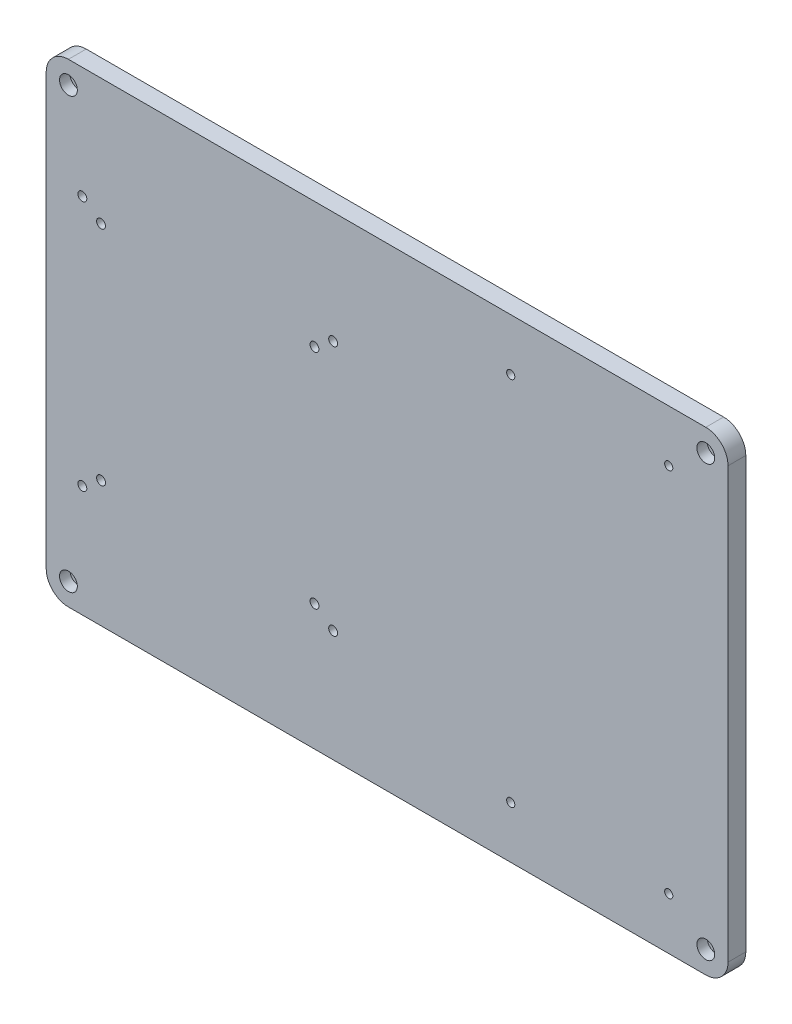
ISO-10303-21;
HEADER;
FILE_DESCRIPTION(('STEP AP214'),'2;1');
FILE_NAME('part.step','',(''),(''),'','','');
FILE_SCHEMA(('AUTOMOTIVE_DESIGN { 1 0 10303 214 1 1 1 1 }'));
ENDSEC;
DATA;
#1=APPLICATION_CONTEXT('core data for automotive mechanical design processes');
#2=APPLICATION_PROTOCOL_DEFINITION('international standard','automotive_design',2000,#1);
#3=PRODUCT_CONTEXT('',#1,'mechanical');
#4=PRODUCT('Part','Part','',(#3));
#5=PRODUCT_RELATED_PRODUCT_CATEGORY('part','',(#4));
#6=PRODUCT_DEFINITION_FORMATION('','',#4);
#7=PRODUCT_DEFINITION_CONTEXT('part definition',#1,'design');
#8=PRODUCT_DEFINITION('design','',#6,#7);
#9=PRODUCT_DEFINITION_SHAPE('','',#8);
#10=(LENGTH_UNIT() NAMED_UNIT(*) SI_UNIT(.MILLI.,.METRE.));
#11=(NAMED_UNIT(*) PLANE_ANGLE_UNIT() SI_UNIT($,.RADIAN.));
#12=(NAMED_UNIT(*) SI_UNIT($,.STERADIAN.) SOLID_ANGLE_UNIT());
#13=UNCERTAINTY_MEASURE_WITH_UNIT(LENGTH_MEASURE(1.E-05),#10,'distance_accuracy_value','');
#14=(GEOMETRIC_REPRESENTATION_CONTEXT(3) GLOBAL_UNCERTAINTY_ASSIGNED_CONTEXT((#13)) GLOBAL_UNIT_ASSIGNED_CONTEXT((#10,
#11,#12)) REPRESENTATION_CONTEXT('',''));
#15=CARTESIAN_POINT('',(0.,0.,0.));
#16=DIRECTION('',(0.,0.,1.));
#17=DIRECTION('',(1.,0.,0.));
#18=AXIS2_PLACEMENT_3D('',#15,#16,#17);
#19=CARTESIAN_POINT('',(-102.8,42.3,0.));
#20=DIRECTION('',(0.,0.,1.));
#21=DIRECTION('',(1.,0.,0.));
#22=AXIS2_PLACEMENT_3D('',#19,#20,#21);
#23=CYLINDRICAL_SURFACE('',#22,1.5);
#24=CARTESIAN_POINT('',(-102.8,42.3,6.));
#25=DIRECTION('',(0.,0.,1.));
#26=DIRECTION('',(1.,0.,0.));
#27=AXIS2_PLACEMENT_3D('',#24,#25,#26);
#28=CIRCLE('',#27,1.5);
#29=CARTESIAN_POINT('',(-101.3,42.3,6.));
#30=VERTEX_POINT('',#29);
#31=EDGE_CURVE('E213',#30,#30,#28,.T.);
#32=ORIENTED_EDGE('',*,*,#31,.T.);
#33=EDGE_LOOP('',(#32));
#34=FACE_BOUND('',#33,.T.);
#35=CARTESIAN_POINT('',(-102.8,42.3,3.5));
#36=DIRECTION('',(0.,0.,-1.));
#37=DIRECTION('',(-1.,0.,0.));
#38=AXIS2_PLACEMENT_3D('',#35,#36,#37);
#39=CIRCLE('',#38,1.5);
#40=CARTESIAN_POINT('',(-104.3,42.3,3.5));
#41=VERTEX_POINT('',#40);
#42=EDGE_CURVE('E38',#41,#41,#39,.F.);
#43=ORIENTED_EDGE('',*,*,#42,.F.);
#44=EDGE_LOOP('',(#43));
#45=FACE_BOUND('',#44,.T.);
#46=ADVANCED_FACE('F34',(#34,#45),#23,.F.);
#47=CARTESIAN_POINT('',(-18.2,-42.3,0.));
#48=DIRECTION('',(0.,0.,1.));
#49=DIRECTION('',(1.,0.,0.));
#50=AXIS2_PLACEMENT_3D('',#47,#48,#49);
#51=CYLINDRICAL_SURFACE('',#50,1.5);
#52=CARTESIAN_POINT('',(-18.2,-42.3,6.));
#53=DIRECTION('',(0.,0.,1.));
#54=DIRECTION('',(1.,0.,0.));
#55=AXIS2_PLACEMENT_3D('',#52,#53,#54);
#56=CIRCLE('',#55,1.5);
#57=CARTESIAN_POINT('',(-16.7,-42.3,6.));
#58=VERTEX_POINT('',#57);
#59=EDGE_CURVE('E214',#58,#58,#56,.T.);
#60=ORIENTED_EDGE('',*,*,#59,.T.);
#61=EDGE_LOOP('',(#60));
#62=FACE_BOUND('',#61,.T.);
#63=CARTESIAN_POINT('',(-18.2,-42.3,3.5));
#64=DIRECTION('',(0.,0.,-1.));
#65=DIRECTION('',(-1.,0.,0.));
#66=AXIS2_PLACEMENT_3D('',#63,#64,#65);
#67=CIRCLE('',#66,1.5);
#68=CARTESIAN_POINT('',(-19.7,-42.3,3.5));
#69=VERTEX_POINT('',#68);
#70=EDGE_CURVE('E193',#69,#69,#67,.F.);
#71=ORIENTED_EDGE('',*,*,#70,.F.);
#72=EDGE_LOOP('',(#71));
#73=FACE_BOUND('',#72,.T.);
#74=ADVANCED_FACE('F324',(#62,#73),#51,.F.);
#75=CARTESIAN_POINT('',(-102.8,-42.3,0.));
#76=DIRECTION('',(0.,0.,1.));
#77=DIRECTION('',(1.,0.,0.));
#78=AXIS2_PLACEMENT_3D('',#75,#76,#77);
#79=CYLINDRICAL_SURFACE('',#78,1.5);
#80=CARTESIAN_POINT('',(-102.8,-42.3,6.));
#81=DIRECTION('',(0.,0.,1.));
#82=DIRECTION('',(1.,0.,0.));
#83=AXIS2_PLACEMENT_3D('',#80,#81,#82);
#84=CIRCLE('',#83,1.5);
#85=CARTESIAN_POINT('',(-101.3,-42.3,6.));
#86=VERTEX_POINT('',#85);
#87=EDGE_CURVE('E210',#86,#86,#84,.T.);
#88=ORIENTED_EDGE('',*,*,#87,.T.);
#89=EDGE_LOOP('',(#88));
#90=FACE_BOUND('',#89,.T.);
#91=CARTESIAN_POINT('',(-102.8,-42.3,3.5));
#92=DIRECTION('',(0.,0.,-1.));
#93=DIRECTION('',(-1.,0.,0.));
#94=AXIS2_PLACEMENT_3D('',#91,#92,#93);
#95=CIRCLE('',#94,1.5);
#96=CARTESIAN_POINT('',(-104.3,-42.3,3.5));
#97=VERTEX_POINT('',#96);
#98=EDGE_CURVE('E191',#97,#97,#95,.F.);
#99=ORIENTED_EDGE('',*,*,#98,.F.);
#100=EDGE_LOOP('',(#99));
#101=FACE_BOUND('',#100,.T.);
#102=ADVANCED_FACE('F330',(#90,#101),#79,.F.);
#103=CARTESIAN_POINT('',(-18.2,42.3,0.));
#104=DIRECTION('',(0.,0.,1.));
#105=DIRECTION('',(1.,0.,0.));
#106=AXIS2_PLACEMENT_3D('',#103,#104,#105);
#107=CYLINDRICAL_SURFACE('',#106,1.5);
#108=CARTESIAN_POINT('',(-18.2,42.3,6.));
#109=DIRECTION('',(0.,0.,1.));
#110=DIRECTION('',(1.,0.,0.));
#111=AXIS2_PLACEMENT_3D('',#108,#109,#110);
#112=CIRCLE('',#111,1.5);
#113=CARTESIAN_POINT('',(-16.7,42.3,6.));
#114=VERTEX_POINT('',#113);
#115=EDGE_CURVE('E189',#114,#114,#112,.T.);
#116=ORIENTED_EDGE('',*,*,#115,.T.);
#117=EDGE_LOOP('',(#116));
#118=FACE_BOUND('',#117,.T.);
#119=CARTESIAN_POINT('',(-18.2,42.3,3.5));
#120=DIRECTION('',(0.,0.,-1.));
#121=DIRECTION('',(-1.,0.,0.));
#122=AXIS2_PLACEMENT_3D('',#119,#120,#121);
#123=CIRCLE('',#122,1.5);
#124=CARTESIAN_POINT('',(-19.7,42.3,3.5));
#125=VERTEX_POINT('',#124);
#126=EDGE_CURVE('E186',#125,#125,#123,.F.);
#127=ORIENTED_EDGE('',*,*,#126,.F.);
#128=EDGE_LOOP('',(#127));
#129=FACE_BOUND('',#128,.T.);
#130=ADVANCED_FACE('F336',(#118,#129),#107,.F.);
#131=CARTESIAN_POINT('',(107.5,72.5,-4.));
#132=DIRECTION('',(0.,0.,1.));
#133=DIRECTION('',(1.,0.,0.));
#134=AXIS2_PLACEMENT_3D('',#131,#132,#133);
#135=CYLINDRICAL_SURFACE('',#134,1.75);
#136=CARTESIAN_POINT('',(107.5,72.5,0.));
#137=DIRECTION('',(0.,0.,1.));
#138=DIRECTION('',(1.,0.,0.));
#139=AXIS2_PLACEMENT_3D('',#136,#137,#138);
#140=CIRCLE('',#139,1.75);
#141=CARTESIAN_POINT('',(109.25,72.5,0.));
#142=VERTEX_POINT('',#141);
#143=EDGE_CURVE('E163',#142,#142,#140,.T.);
#144=ORIENTED_EDGE('',*,*,#143,.F.);
#145=EDGE_LOOP('',(#144));
#146=FACE_BOUND('',#145,.T.);
#147=CARTESIAN_POINT('',(107.5,72.5,2.5));
#148=DIRECTION('',(0.,0.,1.));
#149=DIRECTION('',(1.,0.,0.));
#150=AXIS2_PLACEMENT_3D('',#147,#148,#149);
#151=CIRCLE('',#150,1.75);
#152=CARTESIAN_POINT('',(109.25,72.5,2.5));
#153=VERTEX_POINT('',#152);
#154=EDGE_CURVE('E182',#153,#153,#151,.F.);
#155=ORIENTED_EDGE('',*,*,#154,.F.);
#156=EDGE_LOOP('',(#155));
#157=FACE_BOUND('',#156,.T.);
#158=ADVANCED_FACE('F410',(#146,#157),#135,.F.);
#159=CARTESIAN_POINT('',(107.5,-72.5,-4.));
#160=DIRECTION('',(0.,0.,1.));
#161=DIRECTION('',(1.,0.,0.));
#162=AXIS2_PLACEMENT_3D('',#159,#160,#161);
#163=CYLINDRICAL_SURFACE('',#162,1.75);
#164=CARTESIAN_POINT('',(107.5,-72.5,0.));
#165=DIRECTION('',(0.,0.,1.));
#166=DIRECTION('',(1.,0.,0.));
#167=AXIS2_PLACEMENT_3D('',#164,#165,#166);
#168=CIRCLE('',#167,1.75);
#169=CARTESIAN_POINT('',(109.25,-72.5,0.));
#170=VERTEX_POINT('',#169);
#171=EDGE_CURVE('E166',#170,#170,#168,.T.);
#172=ORIENTED_EDGE('',*,*,#171,.F.);
#173=EDGE_LOOP('',(#172));
#174=FACE_BOUND('',#173,.T.);
#175=CARTESIAN_POINT('',(107.5,-72.5,2.5));
#176=DIRECTION('',(0.,0.,1.));
#177=DIRECTION('',(1.,0.,0.));
#178=AXIS2_PLACEMENT_3D('',#175,#176,#177);
#179=CIRCLE('',#178,1.75);
#180=CARTESIAN_POINT('',(109.25,-72.5,2.5));
#181=VERTEX_POINT('',#180);
#182=EDGE_CURVE('E178',#181,#181,#179,.F.);
#183=ORIENTED_EDGE('',*,*,#182,.F.);
#184=EDGE_LOOP('',(#183));
#185=FACE_BOUND('',#184,.T.);
#186=ADVANCED_FACE('F406',(#174,#185),#163,.F.);
#187=CARTESIAN_POINT('',(-107.5,72.5,-4.));
#188=DIRECTION('',(0.,0.,1.));
#189=DIRECTION('',(1.,0.,0.));
#190=AXIS2_PLACEMENT_3D('',#187,#188,#189);
#191=CYLINDRICAL_SURFACE('',#190,1.75);
#192=CARTESIAN_POINT('',(-107.5,72.5,0.));
#193=DIRECTION('',(0.,0.,1.));
#194=DIRECTION('',(1.,0.,0.));
#195=AXIS2_PLACEMENT_3D('',#192,#193,#194);
#196=CIRCLE('',#195,1.75);
#197=CARTESIAN_POINT('',(-105.75,72.5,0.));
#198=VERTEX_POINT('',#197);
#199=EDGE_CURVE('E162',#198,#198,#196,.T.);
#200=ORIENTED_EDGE('',*,*,#199,.F.);
#201=EDGE_LOOP('',(#200));
#202=FACE_BOUND('',#201,.T.);
#203=CARTESIAN_POINT('',(-107.5,72.5,2.5));
#204=DIRECTION('',(0.,0.,1.));
#205=DIRECTION('',(1.,0.,0.));
#206=AXIS2_PLACEMENT_3D('',#203,#204,#205);
#207=CIRCLE('',#206,1.75);
#208=CARTESIAN_POINT('',(-105.75,72.5,2.5));
#209=VERTEX_POINT('',#208);
#210=EDGE_CURVE('E175',#209,#209,#207,.F.);
#211=ORIENTED_EDGE('',*,*,#210,.F.);
#212=EDGE_LOOP('',(#211));
#213=FACE_BOUND('',#212,.T.);
#214=ADVANCED_FACE('F402',(#202,#213),#191,.F.);
#215=CARTESIAN_POINT('',(-107.5,-72.5,-4.));
#216=DIRECTION('',(0.,0.,1.));
#217=DIRECTION('',(1.,0.,0.));
#218=AXIS2_PLACEMENT_3D('',#215,#216,#217);
#219=CYLINDRICAL_SURFACE('',#218,1.75);
#220=CARTESIAN_POINT('',(-107.5,-72.5,0.));
#221=DIRECTION('',(0.,0.,1.));
#222=DIRECTION('',(1.,0.,0.));
#223=AXIS2_PLACEMENT_3D('',#220,#221,#222);
#224=CIRCLE('',#223,1.75);
#225=CARTESIAN_POINT('',(-105.75,-72.5,0.));
#226=VERTEX_POINT('',#225);
#227=EDGE_CURVE('E137',#226,#226,#224,.T.);
#228=ORIENTED_EDGE('',*,*,#227,.F.);
#229=EDGE_LOOP('',(#228));
#230=FACE_BOUND('',#229,.T.);
#231=CARTESIAN_POINT('',(-107.5,-72.5,2.5));
#232=DIRECTION('',(0.,0.,1.));
#233=DIRECTION('',(1.,0.,0.));
#234=AXIS2_PLACEMENT_3D('',#231,#232,#233);
#235=CIRCLE('',#234,1.75);
#236=CARTESIAN_POINT('',(-105.75,-72.5,2.5));
#237=VERTEX_POINT('',#236);
#238=EDGE_CURVE('E167',#237,#237,#235,.F.);
#239=ORIENTED_EDGE('',*,*,#238,.F.);
#240=EDGE_LOOP('',(#239));
#241=FACE_BOUND('',#240,.T.);
#242=ADVANCED_FACE('F405',(#230,#241),#219,.F.);
#243=CARTESIAN_POINT('',(-107.5,-72.5,6.));
#244=DIRECTION('',(0.,0.,-1.));
#245=DIRECTION('',(-1.,0.,0.));
#246=AXIS2_PLACEMENT_3D('',#243,#244,#245);
#247=CYLINDRICAL_SURFACE('',#246,7.5);
#248=CARTESIAN_POINT('',(-107.5,-72.5,0.));
#249=DIRECTION('',(0.,0.,1.));
#250=DIRECTION('',(1.,0.,0.));
#251=AXIS2_PLACEMENT_3D('',#248,#249,#250);
#252=CIRCLE('',#251,7.5);
#253=CARTESIAN_POINT('',(-115.,-72.5,0.));
#254=VERTEX_POINT('',#253);
#255=CARTESIAN_POINT('',(-107.5,-80.,0.));
#256=VERTEX_POINT('',#255);
#257=EDGE_CURVE('E133',#254,#256,#252,.T.);
#258=ORIENTED_EDGE('',*,*,#257,.T.);
#259=DIRECTION('',(0.,0.,-1.));
#260=VECTOR('',#259,1.);
#261=CARTESIAN_POINT('',(-107.5,-80.,6.));
#262=LINE('',#261,#260);
#263=CARTESIAN_POINT('',(-107.5,-80.,6.));
#264=VERTEX_POINT('',#263);
#265=EDGE_CURVE('E11',#264,#256,#262,.T.);
#266=ORIENTED_EDGE('',*,*,#265,.F.);
#267=CARTESIAN_POINT('',(-107.5,-72.5,6.));
#268=DIRECTION('',(0.,0.,1.));
#269=DIRECTION('',(1.,0.,0.));
#270=AXIS2_PLACEMENT_3D('',#267,#268,#269);
#271=CIRCLE('',#270,7.5);
#272=CARTESIAN_POINT('',(-115.,-72.5,6.));
#273=VERTEX_POINT('',#272);
#274=EDGE_CURVE('E148',#273,#264,#271,.T.);
#275=ORIENTED_EDGE('',*,*,#274,.F.);
#276=DIRECTION('',(0.,0.,-1.));
#277=VECTOR('',#276,1.);
#278=CARTESIAN_POINT('',(-115.,-72.5,6.));
#279=LINE('',#278,#277);
#280=EDGE_CURVE('E129',#273,#254,#279,.T.);
#281=ORIENTED_EDGE('',*,*,#280,.T.);
#282=EDGE_LOOP('',(#258,#266,#275,#281));
#283=FACE_BOUND('',#282,.T.);
#284=ADVANCED_FACE('F36',(#283),#247,.T.);
#285=CARTESIAN_POINT('',(-107.5,-80.,6.));
#286=DIRECTION('',(0.,1.,0.));
#287=DIRECTION('',(0.,0.,1.));
#288=AXIS2_PLACEMENT_3D('',#285,#286,#287);
#289=PLANE('',#288);
#290=DIRECTION('',(1.,0.,0.));
#291=VECTOR('',#290,1.);
#292=CARTESIAN_POINT('',(-107.5,-80.,0.));
#293=LINE('',#292,#291);
#294=CARTESIAN_POINT('',(107.5,-80.,0.));
#295=VERTEX_POINT('',#294);
#296=EDGE_CURVE('E136',#256,#295,#293,.T.);
#297=ORIENTED_EDGE('',*,*,#296,.T.);
#298=DIRECTION('',(0.,0.,-1.));
#299=VECTOR('',#298,1.);
#300=CARTESIAN_POINT('',(107.5,-80.,6.));
#301=LINE('',#300,#299);
#302=CARTESIAN_POINT('',(107.5,-80.,6.));
#303=VERTEX_POINT('',#302);
#304=EDGE_CURVE('E44',#303,#295,#301,.T.);
#305=ORIENTED_EDGE('',*,*,#304,.F.);
#306=DIRECTION('',(1.,0.,0.));
#307=VECTOR('',#306,1.);
#308=CARTESIAN_POINT('',(-107.5,-80.,6.));
#309=LINE('',#308,#307);
#310=EDGE_CURVE('E96',#264,#303,#309,.T.);
#311=ORIENTED_EDGE('',*,*,#310,.F.);
#312=ORIENTED_EDGE('',*,*,#265,.T.);
#313=EDGE_LOOP('',(#297,#305,#311,#312));
#314=FACE_BOUND('',#313,.T.);
#315=ADVANCED_FACE('F597',(#314),#289,.F.);
#316=CARTESIAN_POINT('',(107.5,-72.5,6.));
#317=DIRECTION('',(0.,0.,-1.));
#318=DIRECTION('',(-1.,0.,0.));
#319=AXIS2_PLACEMENT_3D('',#316,#317,#318);
#320=CYLINDRICAL_SURFACE('',#319,7.5);
#321=CARTESIAN_POINT('',(107.5,-72.5,0.));
#322=DIRECTION('',(0.,0.,1.));
#323=DIRECTION('',(1.,0.,0.));
#324=AXIS2_PLACEMENT_3D('',#321,#322,#323);
#325=CIRCLE('',#324,7.5);
#326=CARTESIAN_POINT('',(115.,-72.5,0.));
#327=VERTEX_POINT('',#326);
#328=EDGE_CURVE('E139',#295,#327,#325,.T.);
#329=ORIENTED_EDGE('',*,*,#328,.T.);
#330=DIRECTION('',(0.,0.,-1.));
#331=VECTOR('',#330,1.);
#332=CARTESIAN_POINT('',(115.,-72.5,6.));
#333=LINE('',#332,#331);
#334=CARTESIAN_POINT('',(115.,-72.5,6.));
#335=VERTEX_POINT('',#334);
#336=EDGE_CURVE('E155',#335,#327,#333,.T.);
#337=ORIENTED_EDGE('',*,*,#336,.F.);
#338=CARTESIAN_POINT('',(107.5,-72.5,6.));
#339=DIRECTION('',(0.,0.,1.));
#340=DIRECTION('',(1.,0.,0.));
#341=AXIS2_PLACEMENT_3D('',#338,#339,#340);
#342=CIRCLE('',#341,7.5);
#343=EDGE_CURVE('E292',#303,#335,#342,.T.);
#344=ORIENTED_EDGE('',*,*,#343,.F.);
#345=ORIENTED_EDGE('',*,*,#304,.T.);
#346=EDGE_LOOP('',(#329,#337,#344,#345));
#347=FACE_BOUND('',#346,.T.);
#348=ADVANCED_FACE('F603',(#347),#320,.T.);
#349=CARTESIAN_POINT('',(115.,72.5,6.));
#350=DIRECTION('',(-1.,0.,0.));
#351=DIRECTION('',(0.,-1.,0.));
#352=AXIS2_PLACEMENT_3D('',#349,#350,#351);
#353=PLANE('',#352);
#354=DIRECTION('',(0.,1.,0.));
#355=VECTOR('',#354,1.);
#356=CARTESIAN_POINT('',(115.,72.5,0.));
#357=LINE('',#356,#355);
#358=CARTESIAN_POINT('',(115.,72.5,0.));
#359=VERTEX_POINT('',#358);
#360=EDGE_CURVE('E141',#327,#359,#357,.T.);
#361=ORIENTED_EDGE('',*,*,#360,.T.);
#362=DIRECTION('',(0.,0.,-1.));
#363=VECTOR('',#362,1.);
#364=CARTESIAN_POINT('',(115.,72.5,6.));
#365=LINE('',#364,#363);
#366=CARTESIAN_POINT('',(115.,72.5,6.));
#367=VERTEX_POINT('',#366);
#368=EDGE_CURVE('E152',#367,#359,#365,.T.);
#369=ORIENTED_EDGE('',*,*,#368,.F.);
#370=DIRECTION('',(0.,1.,0.));
#371=VECTOR('',#370,1.);
#372=CARTESIAN_POINT('',(115.,72.5,6.));
#373=LINE('',#372,#371);
#374=EDGE_CURVE('E294',#335,#367,#373,.T.);
#375=ORIENTED_EDGE('',*,*,#374,.F.);
#376=ORIENTED_EDGE('',*,*,#336,.T.);
#377=EDGE_LOOP('',(#361,#369,#375,#376));
#378=FACE_BOUND('',#377,.T.);
#379=ADVANCED_FACE('F300',(#378),#353,.F.);
#380=CARTESIAN_POINT('',(107.5,72.5,6.));
#381=DIRECTION('',(0.,0.,-1.));
#382=DIRECTION('',(-1.,0.,0.));
#383=AXIS2_PLACEMENT_3D('',#380,#381,#382);
#384=CYLINDRICAL_SURFACE('',#383,7.49999999999999);
#385=CARTESIAN_POINT('',(107.5,72.5,0.));
#386=DIRECTION('',(0.,0.,1.));
#387=DIRECTION('',(-1.,0.,0.));
#388=AXIS2_PLACEMENT_3D('',#385,#386,#387);
#389=CIRCLE('',#388,7.49999999999999);
#390=CARTESIAN_POINT('',(107.5,80.,0.));
#391=VERTEX_POINT('',#390);
#392=EDGE_CURVE('E143',#359,#391,#389,.T.);
#393=ORIENTED_EDGE('',*,*,#392,.T.);
#394=DIRECTION('',(0.,0.,-1.));
#395=VECTOR('',#394,1.);
#396=CARTESIAN_POINT('',(107.5,80.,6.));
#397=LINE('',#396,#395);
#398=CARTESIAN_POINT('',(107.5,80.,6.));
#399=VERTEX_POINT('',#398);
#400=EDGE_CURVE('E124',#399,#391,#397,.T.);
#401=ORIENTED_EDGE('',*,*,#400,.F.);
#402=CARTESIAN_POINT('',(107.5,72.5,6.));
#403=DIRECTION('',(0.,0.,1.));
#404=DIRECTION('',(-1.,0.,0.));
#405=AXIS2_PLACEMENT_3D('',#402,#403,#404);
#406=CIRCLE('',#405,7.49999999999999);
#407=EDGE_CURVE('E115',#367,#399,#406,.T.);
#408=ORIENTED_EDGE('',*,*,#407,.F.);
#409=ORIENTED_EDGE('',*,*,#368,.T.);
#410=EDGE_LOOP('',(#393,#401,#408,#409));
#411=FACE_BOUND('',#410,.T.);
#412=ADVANCED_FACE('F304',(#411),#384,.T.);
#413=CARTESIAN_POINT('',(-107.5,80.,6.));
#414=DIRECTION('',(0.,-1.,0.));
#415=DIRECTION('',(0.,0.,-1.));
#416=AXIS2_PLACEMENT_3D('',#413,#414,#415);
#417=PLANE('',#416);
#418=DIRECTION('',(-1.,0.,0.));
#419=VECTOR('',#418,1.);
#420=CARTESIAN_POINT('',(-107.5,80.,0.));
#421=LINE('',#420,#419);
#422=CARTESIAN_POINT('',(-107.5,80.,0.));
#423=VERTEX_POINT('',#422);
#424=EDGE_CURVE('E123',#391,#423,#421,.T.);
#425=ORIENTED_EDGE('',*,*,#424,.T.);
#426=DIRECTION('',(0.,0.,-1.));
#427=VECTOR('',#426,1.);
#428=CARTESIAN_POINT('',(-107.5,80.,6.));
#429=LINE('',#428,#427);
#430=CARTESIAN_POINT('',(-107.5,80.,6.));
#431=VERTEX_POINT('',#430);
#432=EDGE_CURVE('E120',#431,#423,#429,.T.);
#433=ORIENTED_EDGE('',*,*,#432,.F.);
#434=DIRECTION('',(-1.,0.,0.));
#435=VECTOR('',#434,1.);
#436=CARTESIAN_POINT('',(-107.5,80.,6.));
#437=LINE('',#436,#435);
#438=EDGE_CURVE('E109',#399,#431,#437,.T.);
#439=ORIENTED_EDGE('',*,*,#438,.F.);
#440=ORIENTED_EDGE('',*,*,#400,.T.);
#441=EDGE_LOOP('',(#425,#433,#439,#440));
#442=FACE_BOUND('',#441,.T.);
#443=ADVANCED_FACE('F121',(#442),#417,.F.);
#444=CARTESIAN_POINT('',(-107.5,72.5,6.));
#445=DIRECTION('',(0.,0.,-1.));
#446=DIRECTION('',(-1.,0.,0.));
#447=AXIS2_PLACEMENT_3D('',#444,#445,#446);
#448=CYLINDRICAL_SURFACE('',#447,7.49999999999999);
#449=CARTESIAN_POINT('',(-107.5,72.5,0.));
#450=DIRECTION('',(0.,0.,1.));
#451=DIRECTION('',(1.,0.,0.));
#452=AXIS2_PLACEMENT_3D('',#449,#450,#451);
#453=CIRCLE('',#452,7.49999999999999);
#454=CARTESIAN_POINT('',(-115.,72.5,0.));
#455=VERTEX_POINT('',#454);
#456=EDGE_CURVE('E82',#423,#455,#453,.T.);
#457=ORIENTED_EDGE('',*,*,#456,.T.);
#458=DIRECTION('',(0.,0.,-1.));
#459=VECTOR('',#458,1.);
#460=CARTESIAN_POINT('',(-115.,72.5,6.));
#461=LINE('',#460,#459);
#462=CARTESIAN_POINT('',(-115.,72.5,6.));
#463=VERTEX_POINT('',#462);
#464=EDGE_CURVE('E125',#463,#455,#461,.T.);
#465=ORIENTED_EDGE('',*,*,#464,.F.);
#466=CARTESIAN_POINT('',(-107.5,72.5,6.));
#467=DIRECTION('',(0.,0.,1.));
#468=DIRECTION('',(1.,0.,0.));
#469=AXIS2_PLACEMENT_3D('',#466,#467,#468);
#470=CIRCLE('',#469,7.49999999999999);
#471=EDGE_CURVE('E113',#431,#463,#470,.T.);
#472=ORIENTED_EDGE('',*,*,#471,.F.);
#473=ORIENTED_EDGE('',*,*,#432,.T.);
#474=EDGE_LOOP('',(#457,#465,#472,#473));
#475=FACE_BOUND('',#474,.T.);
#476=ADVANCED_FACE('F127',(#475),#448,.T.);
#477=CARTESIAN_POINT('',(-115.,72.5,6.));
#478=DIRECTION('',(1.,0.,0.));
#479=DIRECTION('',(0.,0.,-1.));
#480=AXIS2_PLACEMENT_3D('',#477,#478,#479);
#481=PLANE('',#480);
#482=DIRECTION('',(0.,-1.,0.));
#483=VECTOR('',#482,1.);
#484=CARTESIAN_POINT('',(-115.,72.5,0.));
#485=LINE('',#484,#483);
#486=EDGE_CURVE('E88',#455,#254,#485,.T.);
#487=ORIENTED_EDGE('',*,*,#486,.T.);
#488=ORIENTED_EDGE('',*,*,#280,.F.);
#489=DIRECTION('',(0.,-1.,0.));
#490=VECTOR('',#489,1.);
#491=CARTESIAN_POINT('',(-115.,72.5,6.));
#492=LINE('',#491,#490);
#493=EDGE_CURVE('E53',#463,#273,#492,.T.);
#494=ORIENTED_EDGE('',*,*,#493,.F.);
#495=ORIENTED_EDGE('',*,*,#464,.T.);
#496=EDGE_LOOP('',(#487,#488,#494,#495));
#497=FACE_BOUND('',#496,.T.);
#498=ADVANCED_FACE('F312',(#497),#481,.F.);
#499=CARTESIAN_POINT('',(-107.5,-72.5,6.));
#500=DIRECTION('',(0.,0.,1.));
#501=DIRECTION('',(1.,0.,0.));
#502=AXIS2_PLACEMENT_3D('',#499,#500,#501);
#503=PLANE('',#502);
#504=ORIENTED_EDGE('',*,*,#87,.F.);
#505=EDGE_LOOP('',(#504));
#506=FACE_BOUND('',#505,.T.);
#507=ORIENTED_EDGE('',*,*,#59,.F.);
#508=EDGE_LOOP('',(#507));
#509=FACE_BOUND('',#508,.T.);
#510=ORIENTED_EDGE('',*,*,#115,.F.);
#511=EDGE_LOOP('',(#510));
#512=FACE_BOUND('',#511,.T.);
#513=ORIENTED_EDGE('',*,*,#31,.F.);
#514=EDGE_LOOP('',(#513));
#515=FACE_BOUND('',#514,.T.);
#516=CARTESIAN_POINT('',(95.,62.5,6.));
#517=DIRECTION('',(0.,0.,1.));
#518=DIRECTION('',(1.,0.,0.));
#519=AXIS2_PLACEMENT_3D('',#516,#517,#518);
#520=CIRCLE('',#519,1.375);
#521=CARTESIAN_POINT('',(96.375,62.5,6.));
#522=VERTEX_POINT('',#521);
#523=EDGE_CURVE('E236',#522,#522,#520,.T.);
#524=ORIENTED_EDGE('',*,*,#523,.F.);
#525=EDGE_LOOP('',(#524));
#526=FACE_BOUND('',#525,.T.);
#527=CARTESIAN_POINT('',(41.7,-62.5,6.));
#528=DIRECTION('',(0.,0.,1.));
#529=DIRECTION('',(1.,0.,0.));
#530=AXIS2_PLACEMENT_3D('',#527,#528,#529);
#531=CIRCLE('',#530,1.375);
#532=CARTESIAN_POINT('',(43.075,-62.5,6.));
#533=VERTEX_POINT('',#532);
#534=EDGE_CURVE('E233',#533,#533,#531,.T.);
#535=ORIENTED_EDGE('',*,*,#534,.F.);
#536=EDGE_LOOP('',(#535));
#537=FACE_BOUND('',#536,.T.);
#538=CARTESIAN_POINT('',(41.7,62.5,6.));
#539=DIRECTION('',(0.,0.,1.));
#540=DIRECTION('',(1.,0.,0.));
#541=AXIS2_PLACEMENT_3D('',#538,#539,#540);
#542=CIRCLE('',#541,1.375);
#543=CARTESIAN_POINT('',(43.075,62.5,6.));
#544=VERTEX_POINT('',#543);
#545=EDGE_CURVE('E225',#544,#544,#542,.T.);
#546=ORIENTED_EDGE('',*,*,#545,.F.);
#547=EDGE_LOOP('',(#546));
#548=FACE_BOUND('',#547,.T.);
#549=CARTESIAN_POINT('',(95.,-62.5,6.));
#550=DIRECTION('',(0.,0.,1.));
#551=DIRECTION('',(1.,0.,0.));
#552=AXIS2_PLACEMENT_3D('',#549,#550,#551);
#553=CIRCLE('',#552,1.375);
#554=CARTESIAN_POINT('',(96.375,-62.5,6.));
#555=VERTEX_POINT('',#554);
#556=EDGE_CURVE('E242',#555,#555,#553,.T.);
#557=ORIENTED_EDGE('',*,*,#556,.F.);
#558=EDGE_LOOP('',(#557));
#559=FACE_BOUND('',#558,.T.);
#560=CARTESIAN_POINT('',(-96.5,-37.5,6.));
#561=DIRECTION('',(0.,0.,1.));
#562=DIRECTION('',(1.,0.,0.));
#563=AXIS2_PLACEMENT_3D('',#560,#561,#562);
#564=CIRCLE('',#563,1.5);
#565=CARTESIAN_POINT('',(-95.,-37.5,6.));
#566=VERTEX_POINT('',#565);
#567=EDGE_CURVE('E250',#566,#566,#564,.T.);
#568=ORIENTED_EDGE('',*,*,#567,.F.);
#569=EDGE_LOOP('',(#568));
#570=FACE_BOUND('',#569,.T.);
#571=CARTESIAN_POINT('',(-24.5,37.5,6.));
#572=DIRECTION('',(0.,0.,1.));
#573=DIRECTION('',(1.,0.,0.));
#574=AXIS2_PLACEMENT_3D('',#571,#572,#573);
#575=CIRCLE('',#574,1.5);
#576=CARTESIAN_POINT('',(-23.,37.5,6.));
#577=VERTEX_POINT('',#576);
#578=EDGE_CURVE('E256',#577,#577,#575,.T.);
#579=ORIENTED_EDGE('',*,*,#578,.F.);
#580=EDGE_LOOP('',(#579));
#581=FACE_BOUND('',#580,.T.);
#582=CARTESIAN_POINT('',(-24.5,-37.5,6.));
#583=DIRECTION('',(0.,0.,1.));
#584=DIRECTION('',(1.,0.,0.));
#585=AXIS2_PLACEMENT_3D('',#582,#583,#584);
#586=CIRCLE('',#585,1.5);
#587=CARTESIAN_POINT('',(-23.,-37.5,6.));
#588=VERTEX_POINT('',#587);
#589=EDGE_CURVE('E245',#588,#588,#586,.T.);
#590=ORIENTED_EDGE('',*,*,#589,.F.);
#591=EDGE_LOOP('',(#590));
#592=FACE_BOUND('',#591,.T.);
#593=CARTESIAN_POINT('',(-96.5,37.5,6.));
#594=DIRECTION('',(0.,0.,1.));
#595=DIRECTION('',(1.,0.,0.));
#596=AXIS2_PLACEMENT_3D('',#593,#594,#595);
#597=CIRCLE('',#596,1.5);
#598=CARTESIAN_POINT('',(-95.,37.5,6.));
#599=VERTEX_POINT('',#598);
#600=EDGE_CURVE('E249',#599,#599,#597,.T.);
#601=ORIENTED_EDGE('',*,*,#600,.F.);
#602=EDGE_LOOP('',(#601));
#603=FACE_BOUND('',#602,.T.);
#604=CARTESIAN_POINT('',(-107.5,72.5,6.));
#605=DIRECTION('',(0.,0.,1.));
#606=DIRECTION('',(1.,0.,0.));
#607=AXIS2_PLACEMENT_3D('',#604,#605,#606);
#608=CIRCLE('',#607,3.00000000000001);
#609=CARTESIAN_POINT('',(-104.5,72.5,6.));
#610=VERTEX_POINT('',#609);
#611=EDGE_CURVE('E272',#610,#610,#608,.T.);
#612=ORIENTED_EDGE('',*,*,#611,.F.);
#613=EDGE_LOOP('',(#612));
#614=FACE_BOUND('',#613,.T.);
#615=CARTESIAN_POINT('',(107.5,72.5,6.));
#616=DIRECTION('',(0.,0.,1.));
#617=DIRECTION('',(1.,0.,0.));
#618=AXIS2_PLACEMENT_3D('',#615,#616,#617);
#619=CIRCLE('',#618,3.00000000000001);
#620=CARTESIAN_POINT('',(110.5,72.5,6.));
#621=VERTEX_POINT('',#620);
#622=EDGE_CURVE('E278',#621,#621,#619,.T.);
#623=ORIENTED_EDGE('',*,*,#622,.F.);
#624=EDGE_LOOP('',(#623));
#625=FACE_BOUND('',#624,.T.);
#626=CARTESIAN_POINT('',(107.5,-72.5,6.));
#627=DIRECTION('',(0.,0.,1.));
#628=DIRECTION('',(1.,0.,0.));
#629=AXIS2_PLACEMENT_3D('',#626,#627,#628);
#630=CIRCLE('',#629,3.00000000000001);
#631=CARTESIAN_POINT('',(110.5,-72.5,6.));
#632=VERTEX_POINT('',#631);
#633=EDGE_CURVE('E267',#632,#632,#630,.T.);
#634=ORIENTED_EDGE('',*,*,#633,.F.);
#635=EDGE_LOOP('',(#634));
#636=FACE_BOUND('',#635,.T.);
#637=CARTESIAN_POINT('',(-107.5,-72.5,6.));
#638=DIRECTION('',(0.,0.,1.));
#639=DIRECTION('',(1.,0.,0.));
#640=AXIS2_PLACEMENT_3D('',#637,#638,#639);
#641=CIRCLE('',#640,3.00000000000001);
#642=CARTESIAN_POINT('',(-104.5,-72.5,6.));
#643=VERTEX_POINT('',#642);
#644=EDGE_CURVE('E185',#643,#643,#641,.T.);
#645=ORIENTED_EDGE('',*,*,#644,.F.);
#646=EDGE_LOOP('',(#645));
#647=FACE_BOUND('',#646,.T.);
#648=ORIENTED_EDGE('',*,*,#274,.T.);
#649=ORIENTED_EDGE('',*,*,#310,.T.);
#650=ORIENTED_EDGE('',*,*,#343,.T.);
#651=ORIENTED_EDGE('',*,*,#374,.T.);
#652=ORIENTED_EDGE('',*,*,#407,.T.);
#653=ORIENTED_EDGE('',*,*,#438,.T.);
#654=ORIENTED_EDGE('',*,*,#471,.T.);
#655=ORIENTED_EDGE('',*,*,#493,.T.);
#656=EDGE_LOOP('',(#648,#649,#650,#651,#652,#653,#654,#655));
#657=FACE_BOUND('',#656,.T.);
#658=ADVANCED_FACE('F111',(#506,#509,#512,#515,#526,#537,#548,#559,#570,#581,#592,#603,#614,
#625,#636,#647,#657),#503,.T.);
#659=CARTESIAN_POINT('',(-107.5,-72.5,0.));
#660=DIRECTION('',(0.,0.,1.));
#661=DIRECTION('',(1.,0.,0.));
#662=AXIS2_PLACEMENT_3D('',#659,#660,#661);
#663=PLANE('',#662);
#664=CARTESIAN_POINT('',(-18.2,-42.3,0.));
#665=DIRECTION('',(0.,0.,-1.));
#666=DIRECTION('',(-1.,0.,0.));
#667=AXIS2_PLACEMENT_3D('',#664,#665,#666);
#668=CIRCLE('',#667,3.);
#669=CARTESIAN_POINT('',(-21.2,-42.3,0.));
#670=VERTEX_POINT('',#669);
#671=EDGE_CURVE('E424',#670,#670,#668,.T.);
#672=ORIENTED_EDGE('',*,*,#671,.F.);
#673=EDGE_LOOP('',(#672));
#674=FACE_BOUND('',#673,.T.);
#675=CARTESIAN_POINT('',(-102.8,-42.3,0.));
#676=DIRECTION('',(0.,0.,-1.));
#677=DIRECTION('',(-1.,0.,0.));
#678=AXIS2_PLACEMENT_3D('',#675,#676,#677);
#679=CIRCLE('',#678,3.00000000000001);
#680=CARTESIAN_POINT('',(-105.8,-42.3,0.));
#681=VERTEX_POINT('',#680);
#682=EDGE_CURVE('E428',#681,#681,#679,.T.);
#683=ORIENTED_EDGE('',*,*,#682,.F.);
#684=EDGE_LOOP('',(#683));
#685=FACE_BOUND('',#684,.T.);
#686=CARTESIAN_POINT('',(-102.8,42.3,0.));
#687=DIRECTION('',(0.,0.,-1.));
#688=DIRECTION('',(-1.,0.,0.));
#689=AXIS2_PLACEMENT_3D('',#686,#687,#688);
#690=CIRCLE('',#689,3.00000000000001);
#691=CARTESIAN_POINT('',(-105.8,42.3,0.));
#692=VERTEX_POINT('',#691);
#693=EDGE_CURVE('E432',#692,#692,#690,.T.);
#694=ORIENTED_EDGE('',*,*,#693,.F.);
#695=EDGE_LOOP('',(#694));
#696=FACE_BOUND('',#695,.T.);
#697=CARTESIAN_POINT('',(-18.2,42.3,0.));
#698=DIRECTION('',(0.,0.,-1.));
#699=DIRECTION('',(-1.,0.,0.));
#700=AXIS2_PLACEMENT_3D('',#697,#698,#699);
#701=CIRCLE('',#700,3.);
#702=CARTESIAN_POINT('',(-21.2,42.3,0.));
#703=VERTEX_POINT('',#702);
#704=EDGE_CURVE('E199',#703,#703,#701,.T.);
#705=ORIENTED_EDGE('',*,*,#704,.F.);
#706=EDGE_LOOP('',(#705));
#707=FACE_BOUND('',#706,.T.);
#708=CARTESIAN_POINT('',(95.,62.5,0.));
#709=DIRECTION('',(0.,0.,1.));
#710=DIRECTION('',(1.,0.,0.));
#711=AXIS2_PLACEMENT_3D('',#708,#709,#710);
#712=CIRCLE('',#711,1.375);
#713=CARTESIAN_POINT('',(96.375,62.5,0.));
#714=VERTEX_POINT('',#713);
#715=EDGE_CURVE('E222',#714,#714,#712,.T.);
#716=ORIENTED_EDGE('',*,*,#715,.T.);
#717=EDGE_LOOP('',(#716));
#718=FACE_BOUND('',#717,.T.);
#719=CARTESIAN_POINT('',(41.7,-62.5,0.));
#720=DIRECTION('',(0.,0.,1.));
#721=DIRECTION('',(1.,0.,0.));
#722=AXIS2_PLACEMENT_3D('',#719,#720,#721);
#723=CIRCLE('',#722,1.375);
#724=CARTESIAN_POINT('',(43.075,-62.5,0.));
#725=VERTEX_POINT('',#724);
#726=EDGE_CURVE('E226',#725,#725,#723,.T.);
#727=ORIENTED_EDGE('',*,*,#726,.T.);
#728=EDGE_LOOP('',(#727));
#729=FACE_BOUND('',#728,.T.);
#730=CARTESIAN_POINT('',(41.7,62.5,0.));
#731=DIRECTION('',(0.,0.,1.));
#732=DIRECTION('',(1.,0.,0.));
#733=AXIS2_PLACEMENT_3D('',#730,#731,#732);
#734=CIRCLE('',#733,1.375);
#735=CARTESIAN_POINT('',(43.075,62.5,0.));
#736=VERTEX_POINT('',#735);
#737=EDGE_CURVE('E221',#736,#736,#734,.T.);
#738=ORIENTED_EDGE('',*,*,#737,.T.);
#739=EDGE_LOOP('',(#738));
#740=FACE_BOUND('',#739,.T.);
#741=CARTESIAN_POINT('',(95.,-62.5,0.));
#742=DIRECTION('',(0.,0.,1.));
#743=DIRECTION('',(1.,0.,0.));
#744=AXIS2_PLACEMENT_3D('',#741,#742,#743);
#745=CIRCLE('',#744,1.375);
#746=CARTESIAN_POINT('',(96.375,-62.5,0.));
#747=VERTEX_POINT('',#746);
#748=EDGE_CURVE('E239',#747,#747,#745,.T.);
#749=ORIENTED_EDGE('',*,*,#748,.T.);
#750=EDGE_LOOP('',(#749));
#751=FACE_BOUND('',#750,.T.);
#752=CARTESIAN_POINT('',(-96.5,-37.5,0.));
#753=DIRECTION('',(0.,0.,1.));
#754=DIRECTION('',(1.,0.,0.));
#755=AXIS2_PLACEMENT_3D('',#752,#753,#754);
#756=CIRCLE('',#755,1.5);
#757=CARTESIAN_POINT('',(-95.,-37.5,0.));
#758=VERTEX_POINT('',#757);
#759=EDGE_CURVE('E246',#758,#758,#756,.T.);
#760=ORIENTED_EDGE('',*,*,#759,.T.);
#761=EDGE_LOOP('',(#760));
#762=FACE_BOUND('',#761,.T.);
#763=CARTESIAN_POINT('',(-24.5,37.5,0.));
#764=DIRECTION('',(0.,0.,1.));
#765=DIRECTION('',(1.,0.,0.));
#766=AXIS2_PLACEMENT_3D('',#763,#764,#765);
#767=CIRCLE('',#766,1.5);
#768=CARTESIAN_POINT('',(-23.,37.5,0.));
#769=VERTEX_POINT('',#768);
#770=EDGE_CURVE('E253',#769,#769,#767,.T.);
#771=ORIENTED_EDGE('',*,*,#770,.T.);
#772=EDGE_LOOP('',(#771));
#773=FACE_BOUND('',#772,.T.);
#774=CARTESIAN_POINT('',(-24.5,-37.5,0.));
#775=DIRECTION('',(0.,0.,1.));
#776=DIRECTION('',(1.,0.,0.));
#777=AXIS2_PLACEMENT_3D('',#774,#775,#776);
#778=CIRCLE('',#777,1.5);
#779=CARTESIAN_POINT('',(-23.,-37.5,0.));
#780=VERTEX_POINT('',#779);
#781=EDGE_CURVE('E259',#780,#780,#778,.T.);
#782=ORIENTED_EDGE('',*,*,#781,.T.);
#783=EDGE_LOOP('',(#782));
#784=FACE_BOUND('',#783,.T.);
#785=CARTESIAN_POINT('',(-96.5,37.5,0.));
#786=DIRECTION('',(0.,0.,1.));
#787=DIRECTION('',(1.,0.,0.));
#788=AXIS2_PLACEMENT_3D('',#785,#786,#787);
#789=CIRCLE('',#788,1.5);
#790=CARTESIAN_POINT('',(-95.,37.5,0.));
#791=VERTEX_POINT('',#790);
#792=EDGE_CURVE('E264',#791,#791,#789,.T.);
#793=ORIENTED_EDGE('',*,*,#792,.T.);
#794=EDGE_LOOP('',(#793));
#795=FACE_BOUND('',#794,.T.);
#796=ORIENTED_EDGE('',*,*,#199,.T.);
#797=EDGE_LOOP('',(#796));
#798=FACE_BOUND('',#797,.T.);
#799=ORIENTED_EDGE('',*,*,#171,.T.);
#800=EDGE_LOOP('',(#799));
#801=FACE_BOUND('',#800,.T.);
#802=ORIENTED_EDGE('',*,*,#143,.T.);
#803=EDGE_LOOP('',(#802));
#804=FACE_BOUND('',#803,.T.);
#805=ORIENTED_EDGE('',*,*,#227,.T.);
#806=EDGE_LOOP('',(#805));
#807=FACE_BOUND('',#806,.T.);
#808=ORIENTED_EDGE('',*,*,#257,.F.);
#809=ORIENTED_EDGE('',*,*,#486,.F.);
#810=ORIENTED_EDGE('',*,*,#456,.F.);
#811=ORIENTED_EDGE('',*,*,#424,.F.);
#812=ORIENTED_EDGE('',*,*,#392,.F.);
#813=ORIENTED_EDGE('',*,*,#360,.F.);
#814=ORIENTED_EDGE('',*,*,#328,.F.);
#815=ORIENTED_EDGE('',*,*,#296,.F.);
#816=EDGE_LOOP('',(#808,#809,#810,#811,#812,#813,#814,#815));
#817=FACE_BOUND('',#816,.T.);
#818=ADVANCED_FACE('F307',(#674,#685,#696,#707,#718,#729,#740,#751,#762,#773,#784,#795,#798,
#801,#804,#807,#817),#663,.F.);
#819=CARTESIAN_POINT('',(-107.5,-72.5,2.5));
#820=DIRECTION('',(0.,0.,1.));
#821=DIRECTION('',(1.,0.,0.));
#822=AXIS2_PLACEMENT_3D('',#819,#820,#821);
#823=PLANE('',#822);
#824=CARTESIAN_POINT('',(-107.5,-72.5,2.5));
#825=DIRECTION('',(0.,0.,1.));
#826=DIRECTION('',(1.,0.,0.));
#827=AXIS2_PLACEMENT_3D('',#824,#825,#826);
#828=CIRCLE('',#827,3.00000000000001);
#829=CARTESIAN_POINT('',(-104.5,-72.5,2.5));
#830=VERTEX_POINT('',#829);
#831=EDGE_CURVE('E174',#830,#830,#828,.T.);
#832=ORIENTED_EDGE('',*,*,#831,.T.);
#833=EDGE_LOOP('',(#832));
#834=FACE_BOUND('',#833,.T.);
#835=ORIENTED_EDGE('',*,*,#238,.T.);
#836=EDGE_LOOP('',(#835));
#837=FACE_BOUND('',#836,.T.);
#838=ADVANCED_FACE('F395',(#834,#837),#823,.T.);
#839=CARTESIAN_POINT('',(-107.5,-72.5,2.5));
#840=DIRECTION('',(0.,0.,1.));
#841=DIRECTION('',(1.,0.,0.));
#842=AXIS2_PLACEMENT_3D('',#839,#840,#841);
#843=CYLINDRICAL_SURFACE('',#842,3.00000000000001);
#844=ORIENTED_EDGE('',*,*,#831,.F.);
#845=EDGE_LOOP('',(#844));
#846=FACE_BOUND('',#845,.T.);
#847=ORIENTED_EDGE('',*,*,#644,.T.);
#848=EDGE_LOOP('',(#847));
#849=FACE_BOUND('',#848,.T.);
#850=ADVANCED_FACE('F375',(#846,#849),#843,.F.);
#851=CARTESIAN_POINT('',(-107.5,72.5,2.5));
#852=DIRECTION('',(0.,0.,1.));
#853=DIRECTION('',(1.,0.,0.));
#854=AXIS2_PLACEMENT_3D('',#851,#852,#853);
#855=PLANE('',#854);
#856=CARTESIAN_POINT('',(-107.5,72.5,2.5));
#857=DIRECTION('',(0.,0.,1.));
#858=DIRECTION('',(1.,0.,0.));
#859=AXIS2_PLACEMENT_3D('',#856,#857,#858);
#860=CIRCLE('',#859,3.00000000000001);
#861=CARTESIAN_POINT('',(-104.5,72.5,2.5));
#862=VERTEX_POINT('',#861);
#863=EDGE_CURVE('E179',#862,#862,#860,.T.);
#864=ORIENTED_EDGE('',*,*,#863,.T.);
#865=EDGE_LOOP('',(#864));
#866=FACE_BOUND('',#865,.T.);
#867=ORIENTED_EDGE('',*,*,#210,.T.);
#868=EDGE_LOOP('',(#867));
#869=FACE_BOUND('',#868,.T.);
#870=ADVANCED_FACE('F371',(#866,#869),#855,.T.);
#871=CARTESIAN_POINT('',(-107.5,72.5,2.5));
#872=DIRECTION('',(0.,0.,1.));
#873=DIRECTION('',(1.,0.,0.));
#874=AXIS2_PLACEMENT_3D('',#871,#872,#873);
#875=CYLINDRICAL_SURFACE('',#874,3.00000000000001);
#876=ORIENTED_EDGE('',*,*,#863,.F.);
#877=EDGE_LOOP('',(#876));
#878=FACE_BOUND('',#877,.T.);
#879=ORIENTED_EDGE('',*,*,#611,.T.);
#880=EDGE_LOOP('',(#879));
#881=FACE_BOUND('',#880,.T.);
#882=ADVANCED_FACE('F374',(#878,#881),#875,.F.);
#883=CARTESIAN_POINT('',(107.5,-72.5,2.5));
#884=DIRECTION('',(0.,0.,1.));
#885=DIRECTION('',(1.,0.,0.));
#886=AXIS2_PLACEMENT_3D('',#883,#884,#885);
#887=PLANE('',#886);
#888=CARTESIAN_POINT('',(107.5,-72.5,2.5));
#889=DIRECTION('',(0.,0.,1.));
#890=DIRECTION('',(1.,0.,0.));
#891=AXIS2_PLACEMENT_3D('',#888,#889,#890);
#892=CIRCLE('',#891,3.00000000000001);
#893=CARTESIAN_POINT('',(110.5,-72.5,2.5));
#894=VERTEX_POINT('',#893);
#895=EDGE_CURVE('E281',#894,#894,#892,.T.);
#896=ORIENTED_EDGE('',*,*,#895,.T.);
#897=EDGE_LOOP('',(#896));
#898=FACE_BOUND('',#897,.T.);
#899=ORIENTED_EDGE('',*,*,#182,.T.);
#900=EDGE_LOOP('',(#899));
#901=FACE_BOUND('',#900,.T.);
#902=ADVANCED_FACE('F379',(#898,#901),#887,.T.);
#903=CARTESIAN_POINT('',(107.5,-72.5,2.5));
#904=DIRECTION('',(0.,0.,1.));
#905=DIRECTION('',(1.,0.,0.));
#906=AXIS2_PLACEMENT_3D('',#903,#904,#905);
#907=CYLINDRICAL_SURFACE('',#906,3.00000000000001);
#908=ORIENTED_EDGE('',*,*,#895,.F.);
#909=EDGE_LOOP('',(#908));
#910=FACE_BOUND('',#909,.T.);
#911=ORIENTED_EDGE('',*,*,#633,.T.);
#912=EDGE_LOOP('',(#911));
#913=FACE_BOUND('',#912,.T.);
#914=ADVANCED_FACE('F384',(#910,#913),#907,.F.);
#915=CARTESIAN_POINT('',(107.5,72.5,2.5));
#916=DIRECTION('',(0.,0.,1.));
#917=DIRECTION('',(1.,0.,0.));
#918=AXIS2_PLACEMENT_3D('',#915,#916,#917);
#919=PLANE('',#918);
#920=CARTESIAN_POINT('',(107.5,72.5,2.5));
#921=DIRECTION('',(0.,0.,1.));
#922=DIRECTION('',(1.,0.,0.));
#923=AXIS2_PLACEMENT_3D('',#920,#921,#922);
#924=CIRCLE('',#923,3.00000000000001);
#925=CARTESIAN_POINT('',(110.5,72.5,2.5));
#926=VERTEX_POINT('',#925);
#927=EDGE_CURVE('E275',#926,#926,#924,.T.);
#928=ORIENTED_EDGE('',*,*,#927,.T.);
#929=EDGE_LOOP('',(#928));
#930=FACE_BOUND('',#929,.T.);
#931=ORIENTED_EDGE('',*,*,#154,.T.);
#932=EDGE_LOOP('',(#931));
#933=FACE_BOUND('',#932,.T.);
#934=ADVANCED_FACE('F381',(#930,#933),#919,.T.);
#935=CARTESIAN_POINT('',(107.5,72.5,2.5));
#936=DIRECTION('',(0.,0.,1.));
#937=DIRECTION('',(1.,0.,0.));
#938=AXIS2_PLACEMENT_3D('',#935,#936,#937);
#939=CYLINDRICAL_SURFACE('',#938,3.00000000000001);
#940=ORIENTED_EDGE('',*,*,#927,.F.);
#941=EDGE_LOOP('',(#940));
#942=FACE_BOUND('',#941,.T.);
#943=ORIENTED_EDGE('',*,*,#622,.T.);
#944=EDGE_LOOP('',(#943));
#945=FACE_BOUND('',#944,.T.);
#946=ADVANCED_FACE('F369',(#942,#945),#939,.F.);
#947=CARTESIAN_POINT('',(-96.5,37.5,0.));
#948=DIRECTION('',(0.,0.,1.));
#949=DIRECTION('',(1.,0.,0.));
#950=AXIS2_PLACEMENT_3D('',#947,#948,#949);
#951=CYLINDRICAL_SURFACE('',#950,1.5);
#952=ORIENTED_EDGE('',*,*,#792,.F.);
#953=EDGE_LOOP('',(#952));
#954=FACE_BOUND('',#953,.T.);
#955=ORIENTED_EDGE('',*,*,#600,.T.);
#956=EDGE_LOOP('',(#955));
#957=FACE_BOUND('',#956,.T.);
#958=ADVANCED_FACE('F365',(#954,#957),#951,.F.);
#959=CARTESIAN_POINT('',(-24.5,-37.5,0.));
#960=DIRECTION('',(0.,0.,1.));
#961=DIRECTION('',(1.,0.,0.));
#962=AXIS2_PLACEMENT_3D('',#959,#960,#961);
#963=CYLINDRICAL_SURFACE('',#962,1.5);
#964=ORIENTED_EDGE('',*,*,#781,.F.);
#965=EDGE_LOOP('',(#964));
#966=FACE_BOUND('',#965,.T.);
#967=ORIENTED_EDGE('',*,*,#589,.T.);
#968=EDGE_LOOP('',(#967));
#969=FACE_BOUND('',#968,.T.);
#970=ADVANCED_FACE('F361',(#966,#969),#963,.F.);
#971=CARTESIAN_POINT('',(-24.5,37.5,0.));
#972=DIRECTION('',(0.,0.,1.));
#973=DIRECTION('',(1.,0.,0.));
#974=AXIS2_PLACEMENT_3D('',#971,#972,#973);
#975=CYLINDRICAL_SURFACE('',#974,1.5);
#976=ORIENTED_EDGE('',*,*,#770,.F.);
#977=EDGE_LOOP('',(#976));
#978=FACE_BOUND('',#977,.T.);
#979=ORIENTED_EDGE('',*,*,#578,.T.);
#980=EDGE_LOOP('',(#979));
#981=FACE_BOUND('',#980,.T.);
#982=ADVANCED_FACE('F357',(#978,#981),#975,.F.);
#983=CARTESIAN_POINT('',(-96.5,-37.5,0.));
#984=DIRECTION('',(0.,0.,1.));
#985=DIRECTION('',(1.,0.,0.));
#986=AXIS2_PLACEMENT_3D('',#983,#984,#985);
#987=CYLINDRICAL_SURFACE('',#986,1.5);
#988=ORIENTED_EDGE('',*,*,#759,.F.);
#989=EDGE_LOOP('',(#988));
#990=FACE_BOUND('',#989,.T.);
#991=ORIENTED_EDGE('',*,*,#567,.T.);
#992=EDGE_LOOP('',(#991));
#993=FACE_BOUND('',#992,.T.);
#994=ADVANCED_FACE('F353',(#990,#993),#987,.F.);
#995=CARTESIAN_POINT('',(95.,-62.5,0.));
#996=DIRECTION('',(0.,0.,1.));
#997=DIRECTION('',(1.,0.,0.));
#998=AXIS2_PLACEMENT_3D('',#995,#996,#997);
#999=CYLINDRICAL_SURFACE('',#998,1.375);
#1000=ORIENTED_EDGE('',*,*,#556,.T.);
#1001=EDGE_LOOP('',(#1000));
#1002=FACE_BOUND('',#1001,.T.);
#1003=ORIENTED_EDGE('',*,*,#748,.F.);
#1004=EDGE_LOOP('',(#1003));
#1005=FACE_BOUND('',#1004,.T.);
#1006=ADVANCED_FACE('F349',(#1002,#1005),#999,.F.);
#1007=CARTESIAN_POINT('',(41.7,62.5,0.));
#1008=DIRECTION('',(0.,0.,1.));
#1009=DIRECTION('',(1.,0.,0.));
#1010=AXIS2_PLACEMENT_3D('',#1007,#1008,#1009);
#1011=CYLINDRICAL_SURFACE('',#1010,1.375);
#1012=ORIENTED_EDGE('',*,*,#545,.T.);
#1013=EDGE_LOOP('',(#1012));
#1014=FACE_BOUND('',#1013,.T.);
#1015=ORIENTED_EDGE('',*,*,#737,.F.);
#1016=EDGE_LOOP('',(#1015));
#1017=FACE_BOUND('',#1016,.T.);
#1018=ADVANCED_FACE('F345',(#1014,#1017),#1011,.F.);
#1019=CARTESIAN_POINT('',(41.7,-62.5,0.));
#1020=DIRECTION('',(0.,0.,1.));
#1021=DIRECTION('',(1.,0.,0.));
#1022=AXIS2_PLACEMENT_3D('',#1019,#1020,#1021);
#1023=CYLINDRICAL_SURFACE('',#1022,1.375);
#1024=ORIENTED_EDGE('',*,*,#534,.T.);
#1025=EDGE_LOOP('',(#1024));
#1026=FACE_BOUND('',#1025,.T.);
#1027=ORIENTED_EDGE('',*,*,#726,.F.);
#1028=EDGE_LOOP('',(#1027));
#1029=FACE_BOUND('',#1028,.T.);
#1030=ADVANCED_FACE('F341',(#1026,#1029),#1023,.F.);
#1031=CARTESIAN_POINT('',(95.,62.5,0.));
#1032=DIRECTION('',(0.,0.,1.));
#1033=DIRECTION('',(1.,0.,0.));
#1034=AXIS2_PLACEMENT_3D('',#1031,#1032,#1033);
#1035=CYLINDRICAL_SURFACE('',#1034,1.375);
#1036=ORIENTED_EDGE('',*,*,#523,.T.);
#1037=EDGE_LOOP('',(#1036));
#1038=FACE_BOUND('',#1037,.T.);
#1039=ORIENTED_EDGE('',*,*,#715,.F.);
#1040=EDGE_LOOP('',(#1039));
#1041=FACE_BOUND('',#1040,.T.);
#1042=ADVANCED_FACE('F337',(#1038,#1041),#1035,.F.);
#1043=CARTESIAN_POINT('',(-18.2,42.3,3.5));
#1044=DIRECTION('',(0.,0.,-1.));
#1045=DIRECTION('',(-1.,0.,0.));
#1046=AXIS2_PLACEMENT_3D('',#1043,#1044,#1045);
#1047=PLANE('',#1046);
#1048=CARTESIAN_POINT('',(-18.2,42.3,3.5));
#1049=DIRECTION('',(0.,0.,-1.));
#1050=DIRECTION('',(-1.,0.,0.));
#1051=AXIS2_PLACEMENT_3D('',#1048,#1049,#1050);
#1052=CIRCLE('',#1051,3.);
#1053=CARTESIAN_POINT('',(-21.2,42.3,3.5));
#1054=VERTEX_POINT('',#1053);
#1055=EDGE_CURVE('E190',#1054,#1054,#1052,.T.);
#1056=ORIENTED_EDGE('',*,*,#1055,.T.);
#1057=EDGE_LOOP('',(#1056));
#1058=FACE_BOUND('',#1057,.T.);
#1059=ORIENTED_EDGE('',*,*,#126,.T.);
#1060=EDGE_LOOP('',(#1059));
#1061=FACE_BOUND('',#1060,.T.);
#1062=ADVANCED_FACE('F340',(#1058,#1061),#1047,.T.);
#1063=CARTESIAN_POINT('',(-18.2,42.3,3.5));
#1064=DIRECTION('',(0.,0.,-1.));
#1065=DIRECTION('',(-1.,0.,0.));
#1066=AXIS2_PLACEMENT_3D('',#1063,#1064,#1065);
#1067=CYLINDRICAL_SURFACE('',#1066,3.);
#1068=ORIENTED_EDGE('',*,*,#1055,.F.);
#1069=EDGE_LOOP('',(#1068));
#1070=FACE_BOUND('',#1069,.T.);
#1071=ORIENTED_EDGE('',*,*,#704,.T.);
#1072=EDGE_LOOP('',(#1071));
#1073=FACE_BOUND('',#1072,.T.);
#1074=ADVANCED_FACE('F530',(#1070,#1073),#1067,.F.);
#1075=CARTESIAN_POINT('',(-102.8,-42.3,3.5));
#1076=DIRECTION('',(0.,0.,-1.));
#1077=DIRECTION('',(-1.,0.,0.));
#1078=AXIS2_PLACEMENT_3D('',#1075,#1076,#1077);
#1079=PLANE('',#1078);
#1080=CARTESIAN_POINT('',(-102.8,-42.3,3.5));
#1081=DIRECTION('',(0.,0.,-1.));
#1082=DIRECTION('',(-1.,0.,0.));
#1083=AXIS2_PLACEMENT_3D('',#1080,#1081,#1082);
#1084=CIRCLE('',#1083,3.00000000000001);
#1085=CARTESIAN_POINT('',(-105.8,-42.3,3.5));
#1086=VERTEX_POINT('',#1085);
#1087=EDGE_CURVE('E503',#1086,#1086,#1084,.T.);
#1088=ORIENTED_EDGE('',*,*,#1087,.T.);
#1089=EDGE_LOOP('',(#1088));
#1090=FACE_BOUND('',#1089,.T.);
#1091=ORIENTED_EDGE('',*,*,#98,.T.);
#1092=EDGE_LOOP('',(#1091));
#1093=FACE_BOUND('',#1092,.T.);
#1094=ADVANCED_FACE('F527',(#1090,#1093),#1079,.T.);
#1095=CARTESIAN_POINT('',(-102.8,-42.3,3.5));
#1096=DIRECTION('',(0.,0.,-1.));
#1097=DIRECTION('',(-1.,0.,0.));
#1098=AXIS2_PLACEMENT_3D('',#1095,#1096,#1097);
#1099=CYLINDRICAL_SURFACE('',#1098,3.00000000000001);
#1100=ORIENTED_EDGE('',*,*,#1087,.F.);
#1101=EDGE_LOOP('',(#1100));
#1102=FACE_BOUND('',#1101,.T.);
#1103=ORIENTED_EDGE('',*,*,#682,.T.);
#1104=EDGE_LOOP('',(#1103));
#1105=FACE_BOUND('',#1104,.T.);
#1106=ADVANCED_FACE('F524',(#1102,#1105),#1099,.F.);
#1107=CARTESIAN_POINT('',(-18.2,-42.3,3.5));
#1108=DIRECTION('',(0.,0.,-1.));
#1109=DIRECTION('',(-1.,0.,0.));
#1110=AXIS2_PLACEMENT_3D('',#1107,#1108,#1109);
#1111=PLANE('',#1110);
#1112=CARTESIAN_POINT('',(-18.2,-42.3,3.5));
#1113=DIRECTION('',(0.,0.,-1.));
#1114=DIRECTION('',(-1.,0.,0.));
#1115=AXIS2_PLACEMENT_3D('',#1112,#1113,#1114);
#1116=CIRCLE('',#1115,3.);
#1117=CARTESIAN_POINT('',(-21.2,-42.3,3.5));
#1118=VERTEX_POINT('',#1117);
#1119=EDGE_CURVE('E194',#1118,#1118,#1116,.T.);
#1120=ORIENTED_EDGE('',*,*,#1119,.T.);
#1121=EDGE_LOOP('',(#1120));
#1122=FACE_BOUND('',#1121,.T.);
#1123=ORIENTED_EDGE('',*,*,#70,.T.);
#1124=EDGE_LOOP('',(#1123));
#1125=FACE_BOUND('',#1124,.T.);
#1126=ADVANCED_FACE('F510',(#1122,#1125),#1111,.T.);
#1127=CARTESIAN_POINT('',(-18.2,-42.3,3.5));
#1128=DIRECTION('',(0.,0.,-1.));
#1129=DIRECTION('',(-1.,0.,0.));
#1130=AXIS2_PLACEMENT_3D('',#1127,#1128,#1129);
#1131=CYLINDRICAL_SURFACE('',#1130,3.);
#1132=ORIENTED_EDGE('',*,*,#1119,.F.);
#1133=EDGE_LOOP('',(#1132));
#1134=FACE_BOUND('',#1133,.T.);
#1135=ORIENTED_EDGE('',*,*,#671,.T.);
#1136=EDGE_LOOP('',(#1135));
#1137=FACE_BOUND('',#1136,.T.);
#1138=ADVANCED_FACE('F512',(#1134,#1137),#1131,.F.);
#1139=CARTESIAN_POINT('',(-102.8,42.3,3.5));
#1140=DIRECTION('',(0.,0.,-1.));
#1141=DIRECTION('',(-1.,0.,0.));
#1142=AXIS2_PLACEMENT_3D('',#1139,#1140,#1141);
#1143=PLANE('',#1142);
#1144=CARTESIAN_POINT('',(-102.8,42.3,3.5));
#1145=DIRECTION('',(0.,0.,-1.));
#1146=DIRECTION('',(-1.,0.,0.));
#1147=AXIS2_PLACEMENT_3D('',#1144,#1145,#1146);
#1148=CIRCLE('',#1147,3.00000000000001);
#1149=CARTESIAN_POINT('',(-105.8,42.3,3.5));
#1150=VERTEX_POINT('',#1149);
#1151=EDGE_CURVE('E498',#1150,#1150,#1148,.T.);
#1152=ORIENTED_EDGE('',*,*,#1151,.T.);
#1153=EDGE_LOOP('',(#1152));
#1154=FACE_BOUND('',#1153,.T.);
#1155=ORIENTED_EDGE('',*,*,#42,.T.);
#1156=EDGE_LOOP('',(#1155));
#1157=FACE_BOUND('',#1156,.T.);
#1158=ADVANCED_FACE('F515',(#1154,#1157),#1143,.T.);
#1159=CARTESIAN_POINT('',(-102.8,42.3,3.5));
#1160=DIRECTION('',(0.,0.,-1.));
#1161=DIRECTION('',(-1.,0.,0.));
#1162=AXIS2_PLACEMENT_3D('',#1159,#1160,#1161);
#1163=CYLINDRICAL_SURFACE('',#1162,3.00000000000001);
#1164=ORIENTED_EDGE('',*,*,#1151,.F.);
#1165=EDGE_LOOP('',(#1164));
#1166=FACE_BOUND('',#1165,.T.);
#1167=ORIENTED_EDGE('',*,*,#693,.T.);
#1168=EDGE_LOOP('',(#1167));
#1169=FACE_BOUND('',#1168,.T.);
#1170=ADVANCED_FACE('F521',(#1166,#1169),#1163,.F.);
#1171=CLOSED_SHELL('',(#46,#74,#102,#130,#158,#186,#214,#242,#284,#315,#348,#379,#412,#443,#476,
#498,#658,#818,#838,#850,#870,#882,#902,#914,#934,#946,#958,#970,#982,#994,#1006,#1018,#1030,
#1042,#1062,#1074,#1094,#1106,#1126,#1138,#1158,#1170));
#1172=MANIFOLD_SOLID_BREP('B2',#1171);
#1173=ADVANCED_BREP_SHAPE_REPRESENTATION('',(#18,#1172),#14);
#1174=SHAPE_DEFINITION_REPRESENTATION(#9,#1173);
ENDSEC;
END-ISO-10303-21;
